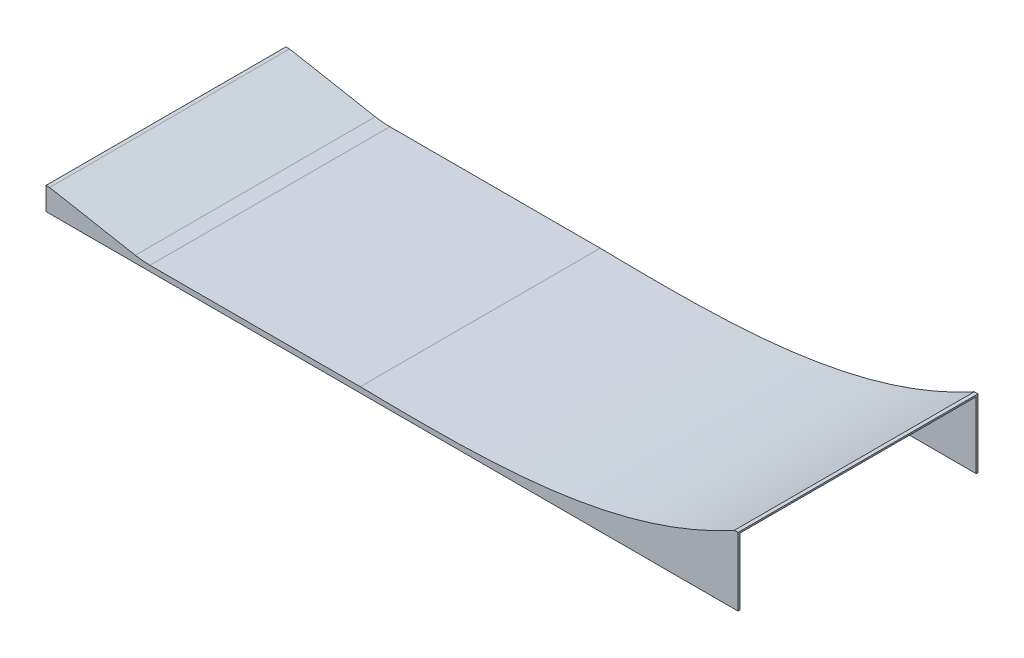
ISO-10303-21;
HEADER;
FILE_DESCRIPTION(('STEP AP214'),'2;1');
FILE_NAME('part.step','',(''),(''),'','','');
FILE_SCHEMA(('AUTOMOTIVE_DESIGN { 1 0 10303 214 1 1 1 1 }'));
ENDSEC;
DATA;
#1=APPLICATION_CONTEXT('core data for automotive mechanical design processes');
#2=APPLICATION_PROTOCOL_DEFINITION('international standard','automotive_design',2000,#1);
#3=PRODUCT_CONTEXT('',#1,'mechanical');
#4=PRODUCT('Part','Part','',(#3));
#5=PRODUCT_RELATED_PRODUCT_CATEGORY('part','',(#4));
#6=PRODUCT_DEFINITION_FORMATION('','',#4);
#7=PRODUCT_DEFINITION_CONTEXT('part definition',#1,'design');
#8=PRODUCT_DEFINITION('design','',#6,#7);
#9=PRODUCT_DEFINITION_SHAPE('','',#8);
#10=(LENGTH_UNIT() NAMED_UNIT(*) SI_UNIT(.MILLI.,.METRE.));
#11=(NAMED_UNIT(*) PLANE_ANGLE_UNIT() SI_UNIT($,.RADIAN.));
#12=(NAMED_UNIT(*) SI_UNIT($,.STERADIAN.) SOLID_ANGLE_UNIT());
#13=UNCERTAINTY_MEASURE_WITH_UNIT(LENGTH_MEASURE(1.E-05),#10,'distance_accuracy_value','');
#14=(GEOMETRIC_REPRESENTATION_CONTEXT(3) GLOBAL_UNCERTAINTY_ASSIGNED_CONTEXT((#13)) GLOBAL_UNIT_ASSIGNED_CONTEXT((#10,
#11,#12)) REPRESENTATION_CONTEXT('',''));
#15=CARTESIAN_POINT('',(0.,0.,0.));
#16=DIRECTION('',(0.,0.,1.));
#17=DIRECTION('',(1.,0.,0.));
#18=AXIS2_PLACEMENT_3D('',#15,#16,#17);
#19=CARTESIAN_POINT('',(-263.506029704713,47.1534422210915,655.98));
#20=DIRECTION('',(0.,1.,0.));
#21=DIRECTION('',(0.,0.,1.));
#22=AXIS2_PLACEMENT_3D('',#19,#20,#21);
#23=PLANE('',#22);
#24=DIRECTION('',(1.,0.,0.));
#25=VECTOR('',#24,1.);
#26=CARTESIAN_POINT('',(-263.506029704713,47.1534422210915,650.98));
#27=LINE('',#26,#25);
#28=CARTESIAN_POINT('',(-263.506029704713,47.1534422210915,650.98));
#29=VERTEX_POINT('',#28);
#30=CARTESIAN_POINT('',(-254.417207332174,47.1534422210915,650.98));
#31=VERTEX_POINT('',#30);
#32=EDGE_CURVE('E50',#29,#31,#27,.T.);
#33=ORIENTED_EDGE('',*,*,#32,.F.);
#34=DIRECTION('',(0.,0.,-1.));
#35=VECTOR('',#34,1.);
#36=CARTESIAN_POINT('',(-263.506029704713,47.1534422210915,655.98));
#37=LINE('',#36,#35);
#38=CARTESIAN_POINT('',(-263.506029704713,47.1534422210915,5.));
#39=VERTEX_POINT('',#38);
#40=EDGE_CURVE('E167',#29,#39,#37,.T.);
#41=ORIENTED_EDGE('',*,*,#40,.T.);
#42=DIRECTION('',(1.,0.,0.));
#43=VECTOR('',#42,1.);
#44=CARTESIAN_POINT('',(-263.506029704713,47.1534422210915,5.));
#45=LINE('',#44,#43);
#46=CARTESIAN_POINT('',(-254.417207332174,47.1534422210915,5.));
#47=VERTEX_POINT('',#46);
#48=EDGE_CURVE('E243',#39,#47,#45,.T.);
#49=ORIENTED_EDGE('',*,*,#48,.T.);
#50=DIRECTION('',(0.,0.,-1.));
#51=VECTOR('',#50,1.);
#52=CARTESIAN_POINT('',(-254.417207332174,47.1534422210915,655.98));
#53=LINE('',#52,#51);
#54=EDGE_CURVE('E405',#31,#47,#53,.T.);
#55=ORIENTED_EDGE('',*,*,#54,.F.);
#56=EDGE_LOOP('',(#33,#41,#49,#55));
#57=FACE_BOUND('',#56,.T.);
#58=ADVANCED_FACE('F33',(#57),#23,.F.);
#59=CARTESIAN_POINT('',(-19.8766554413338,3.68392033592986,655.98));
#60=DIRECTION('',(-0.182235525492141,-0.983254907563956,0.));
#61=DIRECTION('',(0.983254907563956,-0.182235525492141,0.));
#62=AXIS2_PLACEMENT_3D('',#59,#60,#61);
#63=PLANE('',#62);
#64=DIRECTION('',(0.,0.,-1.));
#65=VECTOR('',#64,1.);
#66=CARTESIAN_POINT('',(-19.8766554413338,3.68392033592985,655.98));
#67=LINE('',#66,#65);
#68=CARTESIAN_POINT('',(-19.8766554413338,3.68392033592985,650.98));
#69=VERTEX_POINT('',#68);
#70=CARTESIAN_POINT('',(-19.8766554413338,3.68392033592985,5.));
#71=VERTEX_POINT('',#70);
#72=EDGE_CURVE('E306',#69,#71,#67,.T.);
#73=ORIENTED_EDGE('',*,*,#72,.F.);
#74=DIRECTION('',(-0.983254907563956,0.182235525492141,0.));
#75=VECTOR('',#74,1.);
#76=CARTESIAN_POINT('',(-19.8766554413338,3.68392033592986,650.98));
#77=LINE('',#76,#75);
#78=EDGE_CURVE('E58',#69,#31,#77,.T.);
#79=ORIENTED_EDGE('',*,*,#78,.T.);
#80=ORIENTED_EDGE('',*,*,#54,.T.);
#81=DIRECTION('',(-0.983254907563956,0.182235525492141,0.));
#82=VECTOR('',#81,1.);
#83=CARTESIAN_POINT('',(-19.8766554413338,3.68392033592986,5.));
#84=LINE('',#83,#82);
#85=EDGE_CURVE('E240',#71,#47,#84,.T.);
#86=ORIENTED_EDGE('',*,*,#85,.F.);
#87=EDGE_LOOP('',(#73,#79,#80,#86));
#88=FACE_BOUND('',#87,.T.);
#89=ADVANCED_FACE('F287',(#88),#63,.T.);
#90=CARTESIAN_POINT('',(20.2151601669379,220.,655.98));
#91=DIRECTION('',(0.,0.,-1.));
#92=DIRECTION('',(-1.,0.,0.));
#93=AXIS2_PLACEMENT_3D('',#90,#91,#92);
#94=CYLINDRICAL_SURFACE('',#93,220.);
#95=DIRECTION('',(0.,0.,-1.));
#96=VECTOR('',#95,1.);
#97=CARTESIAN_POINT('',(20.2151601669387,0.,655.98));
#98=LINE('',#97,#96);
#99=CARTESIAN_POINT('',(20.2151601669387,0.,650.98));
#100=VERTEX_POINT('',#99);
#101=CARTESIAN_POINT('',(20.2151601669387,0.,5.));
#102=VERTEX_POINT('',#101);
#103=EDGE_CURVE('E303',#100,#102,#98,.T.);
#104=ORIENTED_EDGE('',*,*,#103,.F.);
#105=CARTESIAN_POINT('',(20.2151601669379,220.,650.98));
#106=DIRECTION('',(0.,0.,1.));
#107=DIRECTION('',(1.,0.,0.));
#108=AXIS2_PLACEMENT_3D('',#105,#106,#107);
#109=CIRCLE('',#108,220.);
#110=EDGE_CURVE('E203',#100,#69,#109,.F.);
#111=ORIENTED_EDGE('',*,*,#110,.T.);
#112=ORIENTED_EDGE('',*,*,#72,.T.);
#113=CARTESIAN_POINT('',(20.2151601669379,220.,5.));
#114=DIRECTION('',(0.,0.,1.));
#115=DIRECTION('',(1.,0.,0.));
#116=AXIS2_PLACEMENT_3D('',#113,#114,#115);
#117=CIRCLE('',#116,220.);
#118=EDGE_CURVE('E237',#102,#71,#117,.F.);
#119=ORIENTED_EDGE('',*,*,#118,.F.);
#120=EDGE_LOOP('',(#104,#111,#112,#119));
#121=FACE_BOUND('',#120,.T.);
#122=ADVANCED_FACE('F292',(#121),#94,.T.);
#123=CARTESIAN_POINT('',(20.2151601669387,0.,655.98));
#124=DIRECTION('',(0.,1.,0.));
#125=DIRECTION('',(0.,0.,1.));
#126=AXIS2_PLACEMENT_3D('',#123,#124,#125);
#127=PLANE('',#126);
#128=DIRECTION('',(1.,0.,0.));
#129=VECTOR('',#128,1.);
#130=CARTESIAN_POINT('',(20.2151601669387,0.,650.98));
#131=LINE('',#130,#129);
#132=CARTESIAN_POINT('',(595.62,0.,650.98));
#133=VERTEX_POINT('',#132);
#134=EDGE_CURVE('E197',#100,#133,#131,.T.);
#135=ORIENTED_EDGE('',*,*,#134,.F.);
#136=ORIENTED_EDGE('',*,*,#103,.T.);
#137=DIRECTION('',(1.,0.,0.));
#138=VECTOR('',#137,1.);
#139=CARTESIAN_POINT('',(20.2151601669387,0.,5.));
#140=LINE('',#139,#138);
#141=CARTESIAN_POINT('',(595.62,0.,5.));
#142=VERTEX_POINT('',#141);
#143=EDGE_CURVE('E231',#102,#142,#140,.T.);
#144=ORIENTED_EDGE('',*,*,#143,.T.);
#145=DIRECTION('',(0.,0.,-1.));
#146=VECTOR('',#145,1.);
#147=CARTESIAN_POINT('',(595.62,0.,655.98));
#148=LINE('',#147,#146);
#149=EDGE_CURVE('E307',#133,#142,#148,.T.);
#150=ORIENTED_EDGE('',*,*,#149,.F.);
#151=EDGE_LOOP('',(#135,#136,#144,#150));
#152=FACE_BOUND('',#151,.T.);
#153=ADVANCED_FACE('F268',(#152),#127,.F.);
#154=CARTESIAN_POINT('',(595.62,0.,655.98));
#155=CARTESIAN_POINT('',(948.042476235538,-6.05188285635589,655.98));
#156=CARTESIAN_POINT('',(1296.65337158133,-5.9728383308148,655.98));
#157=CARTESIAN_POINT('',(1620.87243508459,172.120900395987,655.98));
#158=B_SPLINE_CURVE_WITH_KNOTS('',3,(#154,#155,#156,#157),.UNSPECIFIED.,.F.,.F.,(4,4),(0.,1.),.UNSPECIFIED.);
#159=DIRECTION('',(0.,0.,-1.));
#160=VECTOR('',#159,1.);
#161=SURFACE_OF_LINEAR_EXTRUSION('',#158,#160);
#162=CARTESIAN_POINT('',(595.62,0.,650.98));
#163=CARTESIAN_POINT('',(948.042476235538,-6.05188285635589,650.98));
#164=CARTESIAN_POINT('',(1296.65337158133,-5.9728383308148,650.98));
#165=CARTESIAN_POINT('',(1620.87243508459,172.120900395987,650.98));
#166=B_SPLINE_CURVE_WITH_KNOTS('',3,(#162,#163,#164,#165),.UNSPECIFIED.,.F.,.F.,(4,4),(0.,1.),.UNSPECIFIED.);
#167=CARTESIAN_POINT('',(1620.87243508459,172.120900395987,650.98));
#168=VERTEX_POINT('',#167);
#169=EDGE_CURVE('E192',#133,#168,#166,.T.);
#170=ORIENTED_EDGE('',*,*,#169,.F.);
#171=ORIENTED_EDGE('',*,*,#149,.T.);
#172=CARTESIAN_POINT('',(595.62,0.,5.));
#173=CARTESIAN_POINT('',(948.042476235538,-6.05188285635589,5.));
#174=CARTESIAN_POINT('',(1296.65337158133,-5.9728383308148,5.));
#175=CARTESIAN_POINT('',(1620.87243508459,172.120900395987,5.));
#176=B_SPLINE_CURVE_WITH_KNOTS('',3,(#172,#173,#174,#175),.UNSPECIFIED.,.F.,.F.,(4,4),(0.,1.),.UNSPECIFIED.);
#177=CARTESIAN_POINT('',(1620.87243508459,172.120900395987,5.));
#178=VERTEX_POINT('',#177);
#179=EDGE_CURVE('E226',#142,#178,#176,.T.);
#180=ORIENTED_EDGE('',*,*,#179,.T.);
#181=DIRECTION('',(0.,0.,-1.));
#182=VECTOR('',#181,1.);
#183=CARTESIAN_POINT('',(1620.87243508459,172.120900395987,655.98));
#184=LINE('',#183,#182);
#185=EDGE_CURVE('E311',#168,#178,#184,.T.);
#186=ORIENTED_EDGE('',*,*,#185,.F.);
#187=EDGE_LOOP('',(#170,#171,#180,#186));
#188=FACE_BOUND('',#187,.T.);
#189=ADVANCED_FACE('F263',(#188),#161,.F.);
#190=CARTESIAN_POINT('',(1628.46519474374,172.120900395987,655.98));
#191=DIRECTION('',(0.,-1.,0.));
#192=DIRECTION('',(1.,0.,0.));
#193=AXIS2_PLACEMENT_3D('',#190,#191,#192);
#194=PLANE('',#193);
#195=DIRECTION('',(0.,0.,-1.));
#196=VECTOR('',#195,1.);
#197=CARTESIAN_POINT('',(1628.46519474374,172.120900395987,655.98));
#198=LINE('',#197,#196);
#199=CARTESIAN_POINT('',(1628.46519474374,172.120900395987,650.98));
#200=VERTEX_POINT('',#199);
#201=CARTESIAN_POINT('',(1628.46519474374,172.120900395987,5.));
#202=VERTEX_POINT('',#201);
#203=EDGE_CURVE('E313',#200,#202,#198,.T.);
#204=ORIENTED_EDGE('',*,*,#203,.F.);
#205=DIRECTION('',(-1.,0.,0.));
#206=VECTOR('',#205,1.);
#207=CARTESIAN_POINT('',(1628.46519474374,172.120900395987,650.98));
#208=LINE('',#207,#206);
#209=EDGE_CURVE('E189',#200,#168,#208,.T.);
#210=ORIENTED_EDGE('',*,*,#209,.T.);
#211=ORIENTED_EDGE('',*,*,#185,.T.);
#212=DIRECTION('',(-1.,0.,0.));
#213=VECTOR('',#212,1.);
#214=CARTESIAN_POINT('',(1628.46519474374,172.120900395987,5.));
#215=LINE('',#214,#213);
#216=EDGE_CURVE('E223',#202,#178,#215,.T.);
#217=ORIENTED_EDGE('',*,*,#216,.F.);
#218=EDGE_LOOP('',(#204,#210,#211,#217));
#219=FACE_BOUND('',#218,.T.);
#220=ADVANCED_FACE('F267',(#219),#194,.T.);
#221=CARTESIAN_POINT('',(1618.46519474374,176.503273490716,655.98));
#222=DIRECTION('',(0.,1.,0.));
#223=DIRECTION('',(-1.,0.,0.));
#224=AXIS2_PLACEMENT_3D('',#221,#222,#223);
#225=PLANE('',#224);
#226=DIRECTION('',(0.,0.,-1.));
#227=VECTOR('',#226,1.);
#228=CARTESIAN_POINT('',(1628.46519474374,176.503273490716,655.98));
#229=LINE('',#228,#227);
#230=CARTESIAN_POINT('',(1628.46519474374,176.503273490716,655.98));
#231=VERTEX_POINT('',#230);
#232=CARTESIAN_POINT('',(1628.46519474374,176.503273490716,0.));
#233=VERTEX_POINT('',#232);
#234=EDGE_CURVE('E37',#231,#233,#229,.T.);
#235=ORIENTED_EDGE('',*,*,#234,.T.);
#236=DIRECTION('',(1.,0.,0.));
#237=VECTOR('',#236,1.);
#238=CARTESIAN_POINT('',(1618.46519474374,176.503273490716,0.));
#239=LINE('',#238,#237);
#240=CARTESIAN_POINT('',(1618.46519474374,176.503273490716,0.));
#241=VERTEX_POINT('',#240);
#242=EDGE_CURVE('E246',#241,#233,#239,.T.);
#243=ORIENTED_EDGE('',*,*,#242,.F.);
#244=DIRECTION('',(0.,0.,-1.));
#245=VECTOR('',#244,1.);
#246=CARTESIAN_POINT('',(1618.46519474374,176.503273490716,655.98));
#247=LINE('',#246,#245);
#248=CARTESIAN_POINT('',(1618.46519474374,176.503273490716,655.98));
#249=VERTEX_POINT('',#248);
#250=EDGE_CURVE('E11',#249,#241,#247,.T.);
#251=ORIENTED_EDGE('',*,*,#250,.F.);
#252=DIRECTION('',(1.,0.,0.));
#253=VECTOR('',#252,1.);
#254=CARTESIAN_POINT('',(1618.46519474374,176.503273490716,655.98));
#255=LINE('',#254,#253);
#256=EDGE_CURVE('E247',#249,#231,#255,.T.);
#257=ORIENTED_EDGE('',*,*,#256,.T.);
#258=EDGE_LOOP('',(#235,#243,#251,#257));
#259=FACE_BOUND('',#258,.T.);
#260=ADVANCED_FACE('F35',(#259),#225,.T.);
#261=CARTESIAN_POINT('',(1618.46519474374,176.503273490716,655.98));
#262=CARTESIAN_POINT('',(1613.43329326482,173.739246793447,655.98));
#263=CARTESIAN_POINT('',(1603.31097366084,168.272139079888,655.98));
#264=CARTESIAN_POINT('',(1583.06845998729,157.705877045107,655.98));
#265=CARTESIAN_POINT('',(1557.66181060561,145.118479278485,655.98));
#266=CARTESIAN_POINT('',(1527.04550859756,130.993416544075,655.98));
#267=CARTESIAN_POINT('',(1486.04492614462,113.41775778582,655.98));
#268=CARTESIAN_POINT('',(1434.47257550315,93.7308404922269,655.98));
#269=CARTESIAN_POINT('',(1372.09575798177,73.5065998192556,655.98));
#270=CARTESIAN_POINT('',(1309.25623021925,56.4320835098957,655.98));
#271=CARTESIAN_POINT('',(1224.88968722699,37.5320572636286,655.98));
#272=CARTESIAN_POINT('',(1118.41288174114,20.5310693354093,655.98));
#273=CARTESIAN_POINT('',(989.242237578744,8.72992206390047,655.98));
#274=CARTESIAN_POINT('',(880.632350211093,4.39538699595059,655.98));
#275=CARTESIAN_POINT('',(793.28654716804,3.22546046219778,655.98));
#276=CARTESIAN_POINT('',(727.573912046889,3.24601431360917,655.98));
#277=CARTESIAN_POINT('',(661.707478966392,3.91309520115689,655.98));
#278=CARTESIAN_POINT('',(617.666314008325,4.62215259530329,655.98));
#279=CARTESIAN_POINT('',(595.662927432106,5.,655.98));
#280=B_SPLINE_CURVE_WITH_KNOTS('',3,(#261,#262,#263,#264,#265,#266,#267,#268,#269,#270,#271,
#272,#273,#274,#275,#276,#277,#278,#279),.UNSPECIFIED.,.F.,.F.,(4,1,1,1,1,1,1,1,1,1,1,1,1,1,1,1,
4),(-4.05962606964128E-05,0.015585038055877,0.0312106723724503,0.0624619410055971,
0.0937132096387439,0.124964478271891,0.187467015538184,0.249969552804478,0.312472090070771,
0.374974627337065,0.499979701869652,0.624984776402239,0.749989850934826,0.812492388201119,
0.874994925467413,0.937497462733706,1.),.UNSPECIFIED.);
#281=DIRECTION('',(0.,0.,-1.));
#282=VECTOR('',#281,1.);
#283=SURFACE_OF_LINEAR_EXTRUSION('',#280,#282);
#284=ORIENTED_EDGE('',*,*,#250,.T.);
#285=CARTESIAN_POINT('',(1618.46519474374,176.503273490716,0.));
#286=CARTESIAN_POINT('',(1613.43329326482,173.739246793447,0.));
#287=CARTESIAN_POINT('',(1603.31097366084,168.272139079888,0.));
#288=CARTESIAN_POINT('',(1583.06845998729,157.705877045107,0.));
#289=CARTESIAN_POINT('',(1557.66181060561,145.118479278485,0.));
#290=CARTESIAN_POINT('',(1527.04550859756,130.993416544075,0.));
#291=CARTESIAN_POINT('',(1486.04492614462,113.41775778582,0.));
#292=CARTESIAN_POINT('',(1434.47257550315,93.7308404922269,0.));
#293=CARTESIAN_POINT('',(1372.09575798177,73.5065998192556,0.));
#294=CARTESIAN_POINT('',(1309.25623021925,56.4320835098957,0.));
#295=CARTESIAN_POINT('',(1224.88968722699,37.5320572636286,0.));
#296=CARTESIAN_POINT('',(1118.41288174114,20.5310693354093,0.));
#297=CARTESIAN_POINT('',(989.242237578744,8.72992206390047,0.));
#298=CARTESIAN_POINT('',(880.632350211093,4.39538699595059,0.));
#299=CARTESIAN_POINT('',(793.28654716804,3.22546046219778,0.));
#300=CARTESIAN_POINT('',(727.573912046889,3.24601431360917,0.));
#301=CARTESIAN_POINT('',(661.707478966392,3.91309520115689,0.));
#302=CARTESIAN_POINT('',(617.666314008325,4.62215259530329,0.));
#303=CARTESIAN_POINT('',(595.662927432106,5.,0.));
#304=B_SPLINE_CURVE_WITH_KNOTS('',3,(#285,#286,#287,#288,#289,#290,#291,#292,#293,#294,#295,
#296,#297,#298,#299,#300,#301,#302,#303),.UNSPECIFIED.,.F.,.F.,(4,1,1,1,1,1,1,1,1,1,1,1,1,1,1,1,
4),(-4.05962606964128E-05,0.015585038055877,0.0312106723724503,0.0624619410055971,
0.0937132096387439,0.124964478271891,0.187467015538184,0.249969552804478,0.312472090070771,
0.374974627337065,0.499979701869652,0.624984776402239,0.749989850934826,0.812492388201119,
0.874994925467413,0.937497462733706,1.),.UNSPECIFIED.);
#305=CARTESIAN_POINT('',(595.662927432106,5.,0.));
#306=VERTEX_POINT('',#305);
#307=EDGE_CURVE('E251',#241,#306,#304,.T.);
#308=ORIENTED_EDGE('',*,*,#307,.T.);
#309=DIRECTION('',(0.,0.,-1.));
#310=VECTOR('',#309,1.);
#311=CARTESIAN_POINT('',(595.662927432106,5.,655.98));
#312=LINE('',#311,#310);
#313=CARTESIAN_POINT('',(595.662927432106,5.,655.98));
#314=VERTEX_POINT('',#313);
#315=EDGE_CURVE('E42',#314,#306,#312,.T.);
#316=ORIENTED_EDGE('',*,*,#315,.F.);
#317=EDGE_CURVE('E317',#249,#314,#280,.T.);
#318=ORIENTED_EDGE('',*,*,#317,.F.);
#319=EDGE_LOOP('',(#284,#308,#316,#318));
#320=FACE_BOUND('',#319,.T.);
#321=ADVANCED_FACE('F340',(#320),#283,.F.);
#322=CARTESIAN_POINT('',(20.6745956252782,5.,655.98));
#323=DIRECTION('',(0.,1.,0.));
#324=DIRECTION('',(-1.,0.,0.));
#325=AXIS2_PLACEMENT_3D('',#322,#323,#324);
#326=PLANE('',#325);
#327=ORIENTED_EDGE('',*,*,#315,.T.);
#328=DIRECTION('',(1.,0.,0.));
#329=VECTOR('',#328,1.);
#330=CARTESIAN_POINT('',(20.6745956252782,5.,0.));
#331=LINE('',#330,#329);
#332=CARTESIAN_POINT('',(20.6745956252783,4.99999999999998,0.));
#333=VERTEX_POINT('',#332);
#334=EDGE_CURVE('E389',#333,#306,#331,.T.);
#335=ORIENTED_EDGE('',*,*,#334,.F.);
#336=DIRECTION('',(0.,0.,-1.));
#337=VECTOR('',#336,1.);
#338=CARTESIAN_POINT('',(20.6745956252783,4.99999999999998,655.98));
#339=LINE('',#338,#337);
#340=CARTESIAN_POINT('',(20.6745956252783,4.99999999999998,655.98));
#341=VERTEX_POINT('',#340);
#342=EDGE_CURVE('E400',#341,#333,#339,.T.);
#343=ORIENTED_EDGE('',*,*,#342,.F.);
#344=DIRECTION('',(1.,0.,0.));
#345=VECTOR('',#344,1.);
#346=CARTESIAN_POINT('',(20.6745956252782,5.,655.98));
#347=LINE('',#346,#345);
#348=EDGE_CURVE('E321',#341,#314,#347,.T.);
#349=ORIENTED_EDGE('',*,*,#348,.T.);
#350=EDGE_LOOP('',(#327,#335,#343,#349));
#351=FACE_BOUND('',#350,.T.);
#352=ADVANCED_FACE('F344',(#351),#326,.T.);
#353=CARTESIAN_POINT('',(20.6745956252776,225.,655.98));
#354=DIRECTION('',(0.,0.,-1.));
#355=DIRECTION('',(-1.,0.,0.));
#356=AXIS2_PLACEMENT_3D('',#353,#354,#355);
#357=CYLINDRICAL_SURFACE('',#356,220.);
#358=ORIENTED_EDGE('',*,*,#342,.T.);
#359=CARTESIAN_POINT('',(20.6745956252776,225.,0.));
#360=DIRECTION('',(0.,0.,-1.));
#361=DIRECTION('',(-1.,0.,0.));
#362=AXIS2_PLACEMENT_3D('',#359,#360,#361);
#363=CIRCLE('',#362,220.);
#364=CARTESIAN_POINT('',(-19.4172199829943,8.68392033592986,0.));
#365=VERTEX_POINT('',#364);
#366=EDGE_CURVE('E380',#333,#365,#363,.T.);
#367=ORIENTED_EDGE('',*,*,#366,.T.);
#368=DIRECTION('',(0.,0.,-1.));
#369=VECTOR('',#368,1.);
#370=CARTESIAN_POINT('',(-19.4172199829943,8.68392033592986,655.98));
#371=LINE('',#370,#369);
#372=CARTESIAN_POINT('',(-19.4172199829943,8.68392033592986,655.98));
#373=VERTEX_POINT('',#372);
#374=EDGE_CURVE('E371',#373,#365,#371,.T.);
#375=ORIENTED_EDGE('',*,*,#374,.F.);
#376=CARTESIAN_POINT('',(20.6745956252776,225.,655.98));
#377=DIRECTION('',(0.,0.,-1.));
#378=DIRECTION('',(-1.,0.,0.));
#379=AXIS2_PLACEMENT_3D('',#376,#377,#378);
#380=CIRCLE('',#379,220.);
#381=EDGE_CURVE('E328',#341,#373,#380,.T.);
#382=ORIENTED_EDGE('',*,*,#381,.F.);
#383=EDGE_LOOP('',(#358,#367,#375,#382));
#384=FACE_BOUND('',#383,.T.);
#385=ADVANCED_FACE('F348',(#384),#357,.F.);
#386=CARTESIAN_POINT('',(-19.4172199829943,8.68392033592986,655.98));
#387=DIRECTION('',(-0.182235525492141,-0.983254907563956,0.));
#388=DIRECTION('',(0.983254907563956,-0.182235525492141,0.));
#389=AXIS2_PLACEMENT_3D('',#386,#387,#388);
#390=PLANE('',#389);
#391=ORIENTED_EDGE('',*,*,#374,.T.);
#392=DIRECTION('',(-0.983254907563956,0.182235525492141,0.));
#393=VECTOR('',#392,1.);
#394=CARTESIAN_POINT('',(-19.4172199829943,8.68392033592986,0.));
#395=LINE('',#394,#393);
#396=CARTESIAN_POINT('',(-253.506029704713,52.0697167589112,0.));
#397=VERTEX_POINT('',#396);
#398=EDGE_CURVE('E375',#365,#397,#395,.T.);
#399=ORIENTED_EDGE('',*,*,#398,.T.);
#400=DIRECTION('',(0.,0.,-1.));
#401=VECTOR('',#400,1.);
#402=CARTESIAN_POINT('',(-253.506029704713,52.0697167589112,655.98));
#403=LINE('',#402,#401);
#404=CARTESIAN_POINT('',(-253.506029704713,52.0697167589112,655.98));
#405=VERTEX_POINT('',#404);
#406=EDGE_CURVE('E363',#405,#397,#403,.T.);
#407=ORIENTED_EDGE('',*,*,#406,.F.);
#408=DIRECTION('',(-0.983254907563956,0.182235525492141,0.));
#409=VECTOR('',#408,1.);
#410=CARTESIAN_POINT('',(-19.4172199829943,8.68392033592986,655.98));
#411=LINE('',#410,#409);
#412=EDGE_CURVE('E418',#373,#405,#411,.T.);
#413=ORIENTED_EDGE('',*,*,#412,.F.);
#414=EDGE_LOOP('',(#391,#399,#407,#413));
#415=FACE_BOUND('',#414,.T.);
#416=ADVANCED_FACE('F352',(#415),#390,.F.);
#417=CARTESIAN_POINT('',(-253.506029704713,52.0697167589112,655.98));
#418=DIRECTION('',(0.,-1.,0.));
#419=DIRECTION('',(1.,0.,0.));
#420=AXIS2_PLACEMENT_3D('',#417,#418,#419);
#421=PLANE('',#420);
#422=ORIENTED_EDGE('',*,*,#406,.T.);
#423=DIRECTION('',(-1.,0.,0.));
#424=VECTOR('',#423,1.);
#425=CARTESIAN_POINT('',(-253.506029704713,52.0697167589112,0.));
#426=LINE('',#425,#424);
#427=CARTESIAN_POINT('',(-263.506029704713,52.0697167589112,0.));
#428=VERTEX_POINT('',#427);
#429=EDGE_CURVE('E367',#397,#428,#426,.T.);
#430=ORIENTED_EDGE('',*,*,#429,.T.);
#431=DIRECTION('',(0.,0.,-1.));
#432=VECTOR('',#431,1.);
#433=CARTESIAN_POINT('',(-263.506029704713,52.0697167589112,655.98));
#434=LINE('',#433,#432);
#435=CARTESIAN_POINT('',(-263.506029704713,52.0697167589112,655.98));
#436=VERTEX_POINT('',#435);
#437=EDGE_CURVE('E372',#436,#428,#434,.T.);
#438=ORIENTED_EDGE('',*,*,#437,.F.);
#439=DIRECTION('',(-1.,0.,0.));
#440=VECTOR('',#439,1.);
#441=CARTESIAN_POINT('',(-253.506029704713,52.0697167589112,655.98));
#442=LINE('',#441,#440);
#443=EDGE_CURVE('E369',#405,#436,#442,.T.);
#444=ORIENTED_EDGE('',*,*,#443,.F.);
#445=EDGE_LOOP('',(#422,#430,#438,#444));
#446=FACE_BOUND('',#445,.T.);
#447=ADVANCED_FACE('F284',(#446),#421,.F.);
#448=CARTESIAN_POINT('',(-263.506029704713,52.0697167589112,655.98));
#449=DIRECTION('',(1.,0.,0.));
#450=DIRECTION('',(0.,0.,-1.));
#451=AXIS2_PLACEMENT_3D('',#448,#449,#450);
#452=PLANE('',#451);
#453=ORIENTED_EDGE('',*,*,#437,.T.);
#454=DIRECTION('',(0.,-1.,0.));
#455=VECTOR('',#454,1.);
#456=CARTESIAN_POINT('',(-263.506029704713,52.0697167589112,0.));
#457=LINE('',#456,#455);
#458=CARTESIAN_POINT('',(-263.506029704713,-10.0000000000002,0.));
#459=VERTEX_POINT('',#458);
#460=EDGE_CURVE('E383',#428,#459,#457,.T.);
#461=ORIENTED_EDGE('',*,*,#460,.T.);
#462=DIRECTION('',(0.,0.,-1.));
#463=VECTOR('',#462,1.);
#464=CARTESIAN_POINT('',(-263.506029704713,-10.0000000000002,5.));
#465=LINE('',#464,#463);
#466=CARTESIAN_POINT('',(-263.506029704713,-10.0000000000002,5.));
#467=VERTEX_POINT('',#466);
#468=EDGE_CURVE('E220',#467,#459,#465,.T.);
#469=ORIENTED_EDGE('',*,*,#468,.F.);
#470=DIRECTION('',(0.,-1.,0.));
#471=VECTOR('',#470,1.);
#472=CARTESIAN_POINT('',(-263.506029704713,-10.0000000000002,5.));
#473=LINE('',#472,#471);
#474=EDGE_CURVE('E208',#39,#467,#473,.T.);
#475=ORIENTED_EDGE('',*,*,#474,.F.);
#476=ORIENTED_EDGE('',*,*,#40,.F.);
#477=DIRECTION('',(0.,-1.,0.));
#478=VECTOR('',#477,1.);
#479=CARTESIAN_POINT('',(-263.506029704713,-10.0000000000002,650.98));
#480=LINE('',#479,#478);
#481=CARTESIAN_POINT('',(-263.506029704713,-10.0000000000002,650.98));
#482=VERTEX_POINT('',#481);
#483=EDGE_CURVE('E160',#29,#482,#480,.T.);
#484=ORIENTED_EDGE('',*,*,#483,.T.);
#485=DIRECTION('',(0.,0.,1.));
#486=VECTOR('',#485,1.);
#487=CARTESIAN_POINT('',(-263.506029704713,-10.0000000000002,650.98));
#488=LINE('',#487,#486);
#489=CARTESIAN_POINT('',(-263.506029704713,-10.0000000000002,655.98));
#490=VERTEX_POINT('',#489);
#491=EDGE_CURVE('E164',#482,#490,#488,.T.);
#492=ORIENTED_EDGE('',*,*,#491,.T.);
#493=DIRECTION('',(0.,-1.,0.));
#494=VECTOR('',#493,1.);
#495=CARTESIAN_POINT('',(-263.506029704713,52.0697167589112,655.98));
#496=LINE('',#495,#494);
#497=EDGE_CURVE('E253',#436,#490,#496,.T.);
#498=ORIENTED_EDGE('',*,*,#497,.F.);
#499=EDGE_LOOP('',(#453,#461,#469,#475,#476,#484,#492,#498));
#500=FACE_BOUND('',#499,.T.);
#501=ADVANCED_FACE('F162',(#500),#452,.F.);
#502=CARTESIAN_POINT('',(1628.46519474374,176.503273490716,655.98));
#503=DIRECTION('',(1.,0.,0.));
#504=DIRECTION('',(0.,0.,-1.));
#505=AXIS2_PLACEMENT_3D('',#502,#503,#504);
#506=PLANE('',#505);
#507=DIRECTION('',(0.,-1.,0.));
#508=VECTOR('',#507,1.);
#509=CARTESIAN_POINT('',(1628.46519474374,176.503273490716,655.98));
#510=LINE('',#509,#508);
#511=CARTESIAN_POINT('',(1628.46519474374,-9.99999999999998,655.98));
#512=VERTEX_POINT('',#511);
#513=EDGE_CURVE('E250',#231,#512,#510,.T.);
#514=ORIENTED_EDGE('',*,*,#513,.T.);
#515=DIRECTION('',(0.,0.,1.));
#516=VECTOR('',#515,1.);
#517=CARTESIAN_POINT('',(1628.46519474374,-9.99999999999998,650.98));
#518=LINE('',#517,#516);
#519=CARTESIAN_POINT('',(1628.46519474374,-9.99999999999998,650.98));
#520=VERTEX_POINT('',#519);
#521=EDGE_CURVE('E179',#520,#512,#518,.T.);
#522=ORIENTED_EDGE('',*,*,#521,.F.);
#523=DIRECTION('',(0.,1.,0.));
#524=VECTOR('',#523,1.);
#525=CARTESIAN_POINT('',(1628.46519474374,176.503273490716,650.98));
#526=LINE('',#525,#524);
#527=EDGE_CURVE('E180',#520,#200,#526,.T.);
#528=ORIENTED_EDGE('',*,*,#527,.T.);
#529=ORIENTED_EDGE('',*,*,#203,.T.);
#530=DIRECTION('',(0.,1.,0.));
#531=VECTOR('',#530,1.);
#532=CARTESIAN_POINT('',(1628.46519474374,176.503273490716,5.));
#533=LINE('',#532,#531);
#534=CARTESIAN_POINT('',(1628.46519474374,-9.99999999999998,5.));
#535=VERTEX_POINT('',#534);
#536=EDGE_CURVE('E212',#535,#202,#533,.T.);
#537=ORIENTED_EDGE('',*,*,#536,.F.);
#538=DIRECTION('',(0.,0.,-1.));
#539=VECTOR('',#538,1.);
#540=CARTESIAN_POINT('',(1628.46519474374,-9.99999999999998,5.));
#541=LINE('',#540,#539);
#542=CARTESIAN_POINT('',(1628.46519474374,-9.99999999999998,0.));
#543=VERTEX_POINT('',#542);
#544=EDGE_CURVE('E215',#535,#543,#541,.T.);
#545=ORIENTED_EDGE('',*,*,#544,.T.);
#546=DIRECTION('',(0.,-1.,0.));
#547=VECTOR('',#546,1.);
#548=CARTESIAN_POINT('',(1628.46519474374,176.503273490716,0.));
#549=LINE('',#548,#547);
#550=EDGE_CURVE('E385',#233,#543,#549,.T.);
#551=ORIENTED_EDGE('',*,*,#550,.F.);
#552=ORIENTED_EDGE('',*,*,#234,.F.);
#553=EDGE_LOOP('',(#514,#522,#528,#529,#537,#545,#551,#552));
#554=FACE_BOUND('',#553,.T.);
#555=ADVANCED_FACE('F273',(#554),#506,.T.);
#556=CARTESIAN_POINT('',(1118.8224973169,17.0058421043093,655.98));
#557=DIRECTION('',(0.,0.,-1.));
#558=DIRECTION('',(-1.,0.,0.));
#559=AXIS2_PLACEMENT_3D('',#556,#557,#558);
#560=PLANE('',#559);
#561=ORIENTED_EDGE('',*,*,#497,.T.);
#562=DIRECTION('',(1.,0.,0.));
#563=VECTOR('',#562,1.);
#564=CARTESIAN_POINT('',(1628.46519474374,-9.99999999999998,655.98));
#565=LINE('',#564,#563);
#566=EDGE_CURVE('E171',#490,#512,#565,.T.);
#567=ORIENTED_EDGE('',*,*,#566,.T.);
#568=ORIENTED_EDGE('',*,*,#513,.F.);
#569=ORIENTED_EDGE('',*,*,#256,.F.);
#570=ORIENTED_EDGE('',*,*,#317,.T.);
#571=ORIENTED_EDGE('',*,*,#348,.F.);
#572=ORIENTED_EDGE('',*,*,#381,.T.);
#573=ORIENTED_EDGE('',*,*,#412,.T.);
#574=ORIENTED_EDGE('',*,*,#443,.T.);
#575=EDGE_LOOP('',(#561,#567,#568,#569,#570,#571,#572,#573,#574));
#576=FACE_BOUND('',#575,.T.);
#577=ADVANCED_FACE('F275',(#576),#560,.F.);
#578=CARTESIAN_POINT('',(1118.8224973169,17.0058421043093,0.));
#579=DIRECTION('',(0.,0.,-1.));
#580=DIRECTION('',(-1.,0.,0.));
#581=AXIS2_PLACEMENT_3D('',#578,#579,#580);
#582=PLANE('',#581);
#583=DIRECTION('',(1.,0.,0.));
#584=VECTOR('',#583,1.);
#585=CARTESIAN_POINT('',(1628.46519474374,-9.99999999999998,0.));
#586=LINE('',#585,#584);
#587=EDGE_CURVE('E207',#459,#543,#586,.T.);
#588=ORIENTED_EDGE('',*,*,#587,.F.);
#589=ORIENTED_EDGE('',*,*,#460,.F.);
#590=ORIENTED_EDGE('',*,*,#429,.F.);
#591=ORIENTED_EDGE('',*,*,#398,.F.);
#592=ORIENTED_EDGE('',*,*,#366,.F.);
#593=ORIENTED_EDGE('',*,*,#334,.T.);
#594=ORIENTED_EDGE('',*,*,#307,.F.);
#595=ORIENTED_EDGE('',*,*,#242,.T.);
#596=ORIENTED_EDGE('',*,*,#550,.T.);
#597=EDGE_LOOP('',(#588,#589,#590,#591,#592,#593,#594,#595,#596));
#598=FACE_BOUND('',#597,.T.);
#599=ADVANCED_FACE('F281',(#598),#582,.T.);
#600=CARTESIAN_POINT('',(1118.17980214458,21.9644090424683,5.));
#601=DIRECTION('',(0.,0.,1.));
#602=DIRECTION('',(1.,0.,0.));
#603=AXIS2_PLACEMENT_3D('',#600,#601,#602);
#604=PLANE('',#603);
#605=ORIENTED_EDGE('',*,*,#48,.F.);
#606=ORIENTED_EDGE('',*,*,#474,.T.);
#607=DIRECTION('',(1.,0.,0.));
#608=VECTOR('',#607,1.);
#609=CARTESIAN_POINT('',(1628.46519474374,-9.99999999999998,5.));
#610=LINE('',#609,#608);
#611=EDGE_CURVE('E210',#467,#535,#610,.T.);
#612=ORIENTED_EDGE('',*,*,#611,.T.);
#613=ORIENTED_EDGE('',*,*,#536,.T.);
#614=ORIENTED_EDGE('',*,*,#216,.T.);
#615=ORIENTED_EDGE('',*,*,#179,.F.);
#616=ORIENTED_EDGE('',*,*,#143,.F.);
#617=ORIENTED_EDGE('',*,*,#118,.T.);
#618=ORIENTED_EDGE('',*,*,#85,.T.);
#619=EDGE_LOOP('',(#605,#606,#612,#613,#614,#615,#616,#617,#618));
#620=FACE_BOUND('',#619,.T.);
#621=ADVANCED_FACE('F409',(#620),#604,.T.);
#622=CARTESIAN_POINT('',(1628.46519474374,-9.99999999999998,5.));
#623=DIRECTION('',(0.,1.,0.));
#624=DIRECTION('',(-1.,0.,0.));
#625=AXIS2_PLACEMENT_3D('',#622,#623,#624);
#626=PLANE('',#625);
#627=ORIENTED_EDGE('',*,*,#587,.T.);
#628=ORIENTED_EDGE('',*,*,#544,.F.);
#629=ORIENTED_EDGE('',*,*,#611,.F.);
#630=ORIENTED_EDGE('',*,*,#468,.T.);
#631=EDGE_LOOP('',(#627,#628,#629,#630));
#632=FACE_BOUND('',#631,.T.);
#633=ADVANCED_FACE('F414',(#632),#626,.F.);
#634=CARTESIAN_POINT('',(1118.17980214458,21.9644090424683,650.98));
#635=DIRECTION('',(0.,0.,1.));
#636=DIRECTION('',(1.,0.,0.));
#637=AXIS2_PLACEMENT_3D('',#634,#635,#636);
#638=PLANE('',#637);
#639=ORIENTED_EDGE('',*,*,#483,.F.);
#640=ORIENTED_EDGE('',*,*,#32,.T.);
#641=ORIENTED_EDGE('',*,*,#78,.F.);
#642=ORIENTED_EDGE('',*,*,#110,.F.);
#643=ORIENTED_EDGE('',*,*,#134,.T.);
#644=ORIENTED_EDGE('',*,*,#169,.T.);
#645=ORIENTED_EDGE('',*,*,#209,.F.);
#646=ORIENTED_EDGE('',*,*,#527,.F.);
#647=DIRECTION('',(1.,0.,0.));
#648=VECTOR('',#647,1.);
#649=CARTESIAN_POINT('',(1628.46519474374,-9.99999999999998,650.98));
#650=LINE('',#649,#648);
#651=EDGE_CURVE('E170',#482,#520,#650,.T.);
#652=ORIENTED_EDGE('',*,*,#651,.F.);
#653=EDGE_LOOP('',(#639,#640,#641,#642,#643,#644,#645,#646,#652));
#654=FACE_BOUND('',#653,.T.);
#655=ADVANCED_FACE('F182',(#654),#638,.F.);
#656=CARTESIAN_POINT('',(1628.46519474374,-9.99999999999998,650.98));
#657=DIRECTION('',(0.,-1.,0.));
#658=DIRECTION('',(1.,0.,0.));
#659=AXIS2_PLACEMENT_3D('',#656,#657,#658);
#660=PLANE('',#659);
#661=ORIENTED_EDGE('',*,*,#566,.F.);
#662=ORIENTED_EDGE('',*,*,#491,.F.);
#663=ORIENTED_EDGE('',*,*,#651,.T.);
#664=ORIENTED_EDGE('',*,*,#521,.T.);
#665=EDGE_LOOP('',(#661,#662,#663,#664));
#666=FACE_BOUND('',#665,.T.);
#667=ADVANCED_FACE('F175',(#666),#660,.T.);
#668=CLOSED_SHELL('',(#58,#89,#122,#153,#189,#220,#260,#321,#352,#385,#416,#447,#501,#555,#577,
#599,#621,#633,#655,#667));
#669=MANIFOLD_SOLID_BREP('B2',#668);
#670=ADVANCED_BREP_SHAPE_REPRESENTATION('',(#18,#669),#14);
#671=SHAPE_DEFINITION_REPRESENTATION(#9,#670);
ENDSEC;
END-ISO-10303-21;
